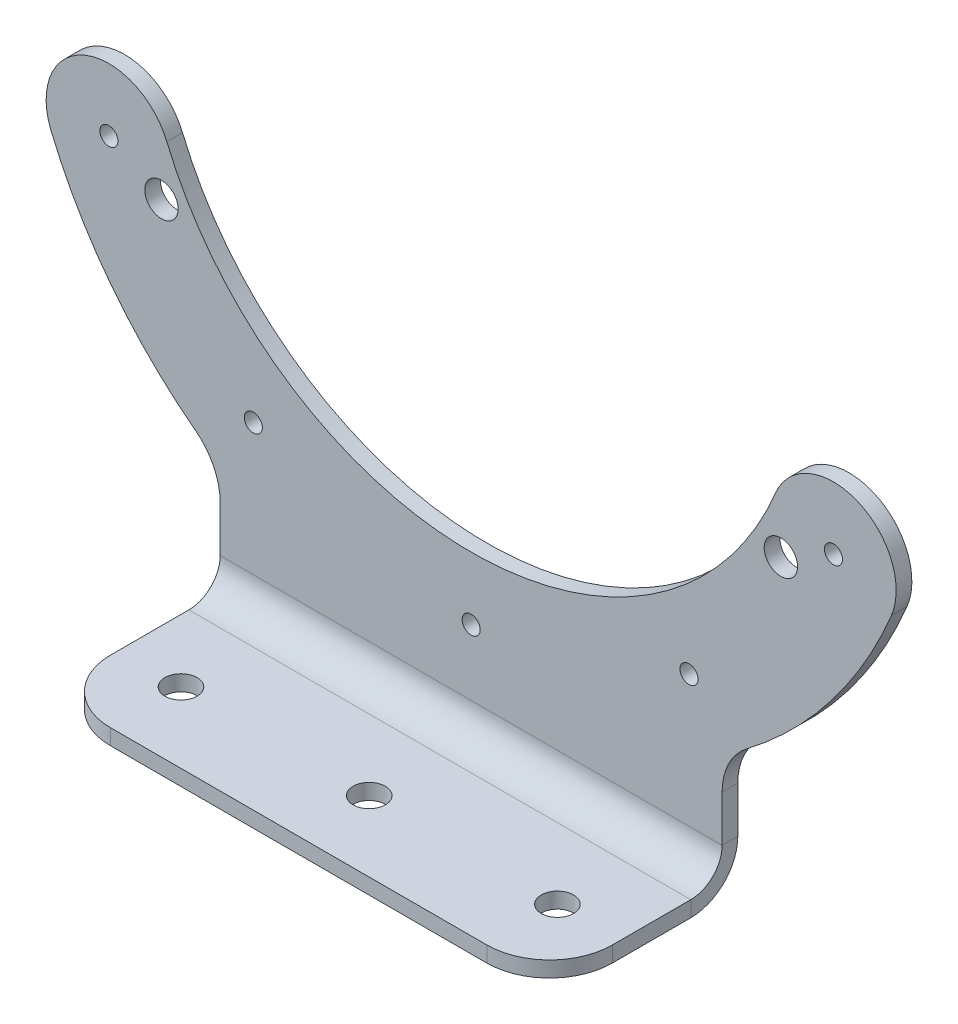
ISO-10303-21;
HEADER;
FILE_DESCRIPTION(('STEP AP214'),'2;1');
FILE_NAME('part.step','',(''),(''),'','','');
FILE_SCHEMA(('AUTOMOTIVE_DESIGN { 1 0 10303 214 1 1 1 1 }'));
ENDSEC;
DATA;
#1=APPLICATION_CONTEXT('core data for automotive mechanical design processes');
#2=APPLICATION_PROTOCOL_DEFINITION('international standard','automotive_design',2000,#1);
#3=PRODUCT_CONTEXT('',#1,'mechanical');
#4=PRODUCT('Part','Part','',(#3));
#5=PRODUCT_RELATED_PRODUCT_CATEGORY('part','',(#4));
#6=PRODUCT_DEFINITION_FORMATION('','',#4);
#7=PRODUCT_DEFINITION_CONTEXT('part definition',#1,'design');
#8=PRODUCT_DEFINITION('design','',#6,#7);
#9=PRODUCT_DEFINITION_SHAPE('','',#8);
#10=(LENGTH_UNIT() NAMED_UNIT(*) SI_UNIT(.MILLI.,.METRE.));
#11=(NAMED_UNIT(*) PLANE_ANGLE_UNIT() SI_UNIT($,.RADIAN.));
#12=(NAMED_UNIT(*) SI_UNIT($,.STERADIAN.) SOLID_ANGLE_UNIT());
#13=UNCERTAINTY_MEASURE_WITH_UNIT(LENGTH_MEASURE(1.E-05),#10,'distance_accuracy_value','');
#14=(GEOMETRIC_REPRESENTATION_CONTEXT(3) GLOBAL_UNCERTAINTY_ASSIGNED_CONTEXT((#13)) GLOBAL_UNIT_ASSIGNED_CONTEXT((#10,
#11,#12)) REPRESENTATION_CONTEXT('',''));
#15=CARTESIAN_POINT('',(0.,0.,0.));
#16=DIRECTION('',(0.,0.,1.));
#17=DIRECTION('',(1.,0.,0.));
#18=AXIS2_PLACEMENT_3D('',#15,#16,#17);
#19=CARTESIAN_POINT('',(50.8,-12.7,-3.175));
#20=DIRECTION('',(1.,0.,0.));
#21=DIRECTION('',(0.,0.,-1.));
#22=AXIS2_PLACEMENT_3D('',#19,#20,#21);
#23=PLANE('',#22);
#24=DIRECTION('',(0.,1.,0.));
#25=VECTOR('',#24,1.);
#26=CARTESIAN_POINT('',(50.8,-12.7,-3.175));
#27=LINE('',#26,#25);
#28=CARTESIAN_POINT('',(50.8,-3.17500000000002,-3.175));
#29=VERTEX_POINT('',#28);
#30=CARTESIAN_POINT('',(50.8,6.15303490016124,-3.175));
#31=VERTEX_POINT('',#30);
#32=EDGE_CURVE('E256',#29,#31,#27,.T.);
#33=ORIENTED_EDGE('',*,*,#32,.T.);
#34=DIRECTION('',(0.,0.,-1.));
#35=VECTOR('',#34,1.);
#36=CARTESIAN_POINT('',(50.8,6.15303490016124,0.));
#37=LINE('',#36,#35);
#38=CARTESIAN_POINT('',(50.8,6.15303490016124,0.));
#39=VERTEX_POINT('',#38);
#40=EDGE_CURVE('E301',#31,#39,#37,.F.);
#41=ORIENTED_EDGE('',*,*,#40,.T.);
#42=DIRECTION('',(0.,1.,0.));
#43=VECTOR('',#42,1.);
#44=CARTESIAN_POINT('',(50.8,-12.7,0.));
#45=LINE('',#44,#43);
#46=CARTESIAN_POINT('',(50.8,-3.17500000000003,0.));
#47=VERTEX_POINT('',#46);
#48=EDGE_CURVE('E242',#47,#39,#45,.T.);
#49=ORIENTED_EDGE('',*,*,#48,.F.);
#50=DIRECTION('',(0.,0.,-1.));
#51=VECTOR('',#50,1.);
#52=CARTESIAN_POINT('',(50.8,-3.17500000000002,0.));
#53=LINE('',#52,#51);
#54=EDGE_CURVE('E225',#47,#29,#53,.T.);
#55=ORIENTED_EDGE('',*,*,#54,.T.);
#56=EDGE_LOOP('',(#33,#41,#49,#55));
#57=FACE_BOUND('',#56,.T.);
#58=ADVANCED_FACE('F56',(#57),#23,.T.);
#59=CARTESIAN_POINT('',(0.,89.4930050525437,-3.175));
#60=DIRECTION('',(0.,0.,1.));
#61=DIRECTION('',(1.,0.,0.));
#62=AXIS2_PLACEMENT_3D('',#59,#60,#61);
#63=PLANE('',#62);
#64=CARTESIAN_POINT('',(-62.6915789799556,53.2980050525438,-3.175));
#65=DIRECTION('',(0.,0.,1.));
#66=DIRECTION('',(1.,0.,0.));
#67=AXIS2_PLACEMENT_3D('',#64,#65,#66);
#68=CIRCLE('',#67,3.37819999999999);
#69=CARTESIAN_POINT('',(-59.3133789799556,53.2980050525438,-3.175));
#70=VERTEX_POINT('',#69);
#71=EDGE_CURVE('E775',#70,#70,#68,.T.);
#72=ORIENTED_EDGE('',*,*,#71,.T.);
#73=EDGE_LOOP('',(#72));
#74=FACE_BOUND('',#73,.T.);
#75=CARTESIAN_POINT('',(62.6915789799556,53.2980050525438,-3.175));
#76=DIRECTION('',(0.,0.,1.));
#77=DIRECTION('',(1.,0.,0.));
#78=AXIS2_PLACEMENT_3D('',#75,#76,#77);
#79=CIRCLE('',#78,3.37819999999998);
#80=CARTESIAN_POINT('',(66.0697789799556,53.2980050525438,-3.175));
#81=VERTEX_POINT('',#80);
#82=EDGE_CURVE('E771',#81,#81,#79,.T.);
#83=ORIENTED_EDGE('',*,*,#82,.T.);
#84=EDGE_LOOP('',(#83));
#85=FACE_BOUND('',#84,.T.);
#86=CARTESIAN_POINT('',(73.3329378930834,59.1175076085648,-3.175));
#87=DIRECTION('',(0.,0.,1.));
#88=DIRECTION('',(1.,0.,0.));
#89=AXIS2_PLACEMENT_3D('',#86,#87,#88);
#90=CIRCLE('',#89,1.82879999999999);
#91=CARTESIAN_POINT('',(75.1617378930834,59.1175076085648,-3.175));
#92=VERTEX_POINT('',#91);
#93=EDGE_CURVE('E767',#92,#92,#90,.T.);
#94=ORIENTED_EDGE('',*,*,#93,.T.);
#95=EDGE_LOOP('',(#94));
#96=FACE_BOUND('',#95,.T.);
#97=CARTESIAN_POINT('',(44.0983872459309,23.4951045760292,-3.175));
#98=DIRECTION('',(0.,0.,1.));
#99=DIRECTION('',(1.,0.,0.));
#100=AXIS2_PLACEMENT_3D('',#97,#98,#99);
#101=CIRCLE('',#100,1.82879999999999);
#102=CARTESIAN_POINT('',(45.9271872459309,23.4951045760292,-3.175));
#103=VERTEX_POINT('',#102);
#104=EDGE_CURVE('E763',#103,#103,#101,.T.);
#105=ORIENTED_EDGE('',*,*,#104,.T.);
#106=EDGE_LOOP('',(#105));
#107=FACE_BOUND('',#106,.T.);
#108=CARTESIAN_POINT('',(-1.11022302462516E-13,10.1180050525437,-3.175));
#109=DIRECTION('',(0.,0.,1.));
#110=DIRECTION('',(1.,0.,0.));
#111=AXIS2_PLACEMENT_3D('',#108,#109,#110);
#112=CIRCLE('',#111,1.82879999999999);
#113=CARTESIAN_POINT('',(1.82879999999988,10.1180050525437,-3.175));
#114=VERTEX_POINT('',#113);
#115=EDGE_CURVE('E758',#114,#114,#112,.T.);
#116=ORIENTED_EDGE('',*,*,#115,.T.);
#117=EDGE_LOOP('',(#116));
#118=FACE_BOUND('',#117,.T.);
#119=CARTESIAN_POINT('',(-44.0983872459311,23.4951045760293,-3.175));
#120=DIRECTION('',(0.,0.,1.));
#121=DIRECTION('',(1.,0.,0.));
#122=AXIS2_PLACEMENT_3D('',#119,#120,#121);
#123=CIRCLE('',#122,1.82879999999999);
#124=CARTESIAN_POINT('',(-42.2695872459311,23.4951045760293,-3.175));
#125=VERTEX_POINT('',#124);
#126=EDGE_CURVE('E436',#125,#125,#123,.T.);
#127=ORIENTED_EDGE('',*,*,#126,.T.);
#128=EDGE_LOOP('',(#127));
#129=FACE_BOUND('',#128,.T.);
#130=CARTESIAN_POINT('',(-73.3329378930835,59.117507608565,-3.175));
#131=DIRECTION('',(0.,0.,1.));
#132=DIRECTION('',(1.,0.,0.));
#133=AXIS2_PLACEMENT_3D('',#130,#131,#132);
#134=CIRCLE('',#133,1.82879999999999);
#135=CARTESIAN_POINT('',(-71.5041378930835,59.117507608565,-3.175));
#136=VERTEX_POINT('',#135);
#137=EDGE_CURVE('E435',#136,#136,#134,.T.);
#138=ORIENTED_EDGE('',*,*,#137,.T.);
#139=EDGE_LOOP('',(#138));
#140=FACE_BOUND('',#139,.T.);
#141=DIRECTION('',(1.,0.,0.));
#142=VECTOR('',#141,1.);
#143=CARTESIAN_POINT('',(50.8,-3.17500000000002,-3.175));
#144=LINE('',#143,#142);
#145=CARTESIAN_POINT('',(-50.8,-3.17500000000001,-3.175));
#146=VERTEX_POINT('',#145);
#147=EDGE_CURVE('E176',#29,#146,#144,.F.);
#148=ORIENTED_EDGE('',*,*,#147,.T.);
#149=DIRECTION('',(0.,-1.,0.));
#150=VECTOR('',#149,1.);
#151=CARTESIAN_POINT('',(-50.8,-12.7,-3.175));
#152=LINE('',#151,#150);
#153=CARTESIAN_POINT('',(-50.8,6.15303490016124,-3.175));
#154=VERTEX_POINT('',#153);
#155=EDGE_CURVE('E254',#154,#146,#152,.T.);
#156=ORIENTED_EDGE('',*,*,#155,.F.);
#157=CARTESIAN_POINT('',(-63.5,6.15303490016124,-3.175));
#158=DIRECTION('',(0.,0.,1.));
#159=DIRECTION('',(1.,0.,0.));
#160=AXIS2_PLACEMENT_3D('',#157,#158,#159);
#161=CIRCLE('',#160,12.7);
#162=CARTESIAN_POINT('',(-55.8030303030303,16.2548494640864,-3.175));
#163=VERTEX_POINT('',#162);
#164=EDGE_CURVE('E13',#154,#163,#161,.T.);
#165=ORIENTED_EDGE('',*,*,#164,.T.);
#166=CARTESIAN_POINT('',(0.,89.4930050525437,-3.175));
#167=DIRECTION('',(0.,0.,1.));
#168=DIRECTION('',(1.,0.,0.));
#169=AXIS2_PLACEMENT_3D('',#166,#167,#168);
#170=CIRCLE('',#169,92.075);
#171=CARTESIAN_POINT('',(-85.0662079559768,54.2574280175283,-3.175));
#172=VERTEX_POINT('',#171);
#173=EDGE_CURVE('E251',#172,#163,#170,.T.);
#174=ORIENTED_EDGE('',*,*,#173,.F.);
#175=CARTESIAN_POINT('',(-73.3329378930835,59.1175076085649,-3.175));
#176=DIRECTION('',(0.,0.,1.));
#177=DIRECTION('',(-1.,0.,0.));
#178=AXIS2_PLACEMENT_3D('',#175,#176,#177);
#179=CIRCLE('',#178,12.7);
#180=CARTESIAN_POINT('',(-61.5996678301901,63.9775871996015,-3.175));
#181=VERTEX_POINT('',#180);
#182=EDGE_CURVE('E248',#181,#172,#179,.T.);
#183=ORIENTED_EDGE('',*,*,#182,.F.);
#184=CARTESIAN_POINT('',(0.,89.4930050525437,-3.175));
#185=DIRECTION('',(0.,0.,-1.));
#186=DIRECTION('',(1.,0.,0.));
#187=AXIS2_PLACEMENT_3D('',#184,#185,#186);
#188=CIRCLE('',#187,66.675);
#189=CARTESIAN_POINT('',(61.5996678301901,63.9775871996015,-3.175));
#190=VERTEX_POINT('',#189);
#191=EDGE_CURVE('E245',#190,#181,#188,.T.);
#192=ORIENTED_EDGE('',*,*,#191,.F.);
#193=CARTESIAN_POINT('',(73.3329378930835,59.1175076085649,-3.175));
#194=DIRECTION('',(0.,0.,1.));
#195=DIRECTION('',(-1.,0.,0.));
#196=AXIS2_PLACEMENT_3D('',#193,#194,#195);
#197=CIRCLE('',#196,12.7);
#198=CARTESIAN_POINT('',(85.0662079559769,54.2574280175283,-3.175));
#199=VERTEX_POINT('',#198);
#200=EDGE_CURVE('E241',#199,#190,#197,.T.);
#201=ORIENTED_EDGE('',*,*,#200,.F.);
#202=CARTESIAN_POINT('',(0.,89.4930050525437,-3.175));
#203=DIRECTION('',(0.,0.,1.));
#204=DIRECTION('',(1.,0.,0.));
#205=AXIS2_PLACEMENT_3D('',#202,#203,#204);
#206=CIRCLE('',#205,92.075);
#207=CARTESIAN_POINT('',(55.8030303030303,16.2548494640864,-3.175));
#208=VERTEX_POINT('',#207);
#209=EDGE_CURVE('E239',#208,#199,#206,.T.);
#210=ORIENTED_EDGE('',*,*,#209,.F.);
#211=CARTESIAN_POINT('',(63.5,6.15303490016124,-3.175));
#212=DIRECTION('',(0.,0.,1.));
#213=DIRECTION('',(1.,0.,0.));
#214=AXIS2_PLACEMENT_3D('',#211,#212,#213);
#215=CIRCLE('',#214,12.7);
#216=EDGE_CURVE('E312',#208,#31,#215,.T.);
#217=ORIENTED_EDGE('',*,*,#216,.T.);
#218=ORIENTED_EDGE('',*,*,#32,.F.);
#219=EDGE_LOOP('',(#148,#156,#165,#174,#183,#192,#201,#210,#217,#218));
#220=FACE_BOUND('',#219,.T.);
#221=ADVANCED_FACE('F316',(#74,#85,#96,#107,#118,#129,#140,#220),#63,.F.);
#222=CARTESIAN_POINT('',(0.,89.4930050525437,0.));
#223=DIRECTION('',(0.,0.,1.));
#224=DIRECTION('',(1.,0.,0.));
#225=AXIS2_PLACEMENT_3D('',#222,#223,#224);
#226=PLANE('',#225);
#227=CARTESIAN_POINT('',(-62.6915789799556,53.2980050525438,0.));
#228=DIRECTION('',(0.,0.,1.));
#229=DIRECTION('',(1.,0.,0.));
#230=AXIS2_PLACEMENT_3D('',#227,#228,#229);
#231=CIRCLE('',#230,3.37819999999999);
#232=CARTESIAN_POINT('',(-59.3133789799556,53.2980050525438,0.));
#233=VERTEX_POINT('',#232);
#234=EDGE_CURVE('E410',#233,#233,#231,.T.);
#235=ORIENTED_EDGE('',*,*,#234,.F.);
#236=EDGE_LOOP('',(#235));
#237=FACE_BOUND('',#236,.T.);
#238=CARTESIAN_POINT('',(62.6915789799556,53.2980050525438,0.));
#239=DIRECTION('',(0.,0.,1.));
#240=DIRECTION('',(1.,0.,0.));
#241=AXIS2_PLACEMENT_3D('',#238,#239,#240);
#242=CIRCLE('',#241,3.37819999999998);
#243=CARTESIAN_POINT('',(66.0697789799556,53.2980050525438,0.));
#244=VERTEX_POINT('',#243);
#245=EDGE_CURVE('E414',#244,#244,#242,.T.);
#246=ORIENTED_EDGE('',*,*,#245,.F.);
#247=EDGE_LOOP('',(#246));
#248=FACE_BOUND('',#247,.T.);
#249=CARTESIAN_POINT('',(73.3329378930834,59.1175076085648,0.));
#250=DIRECTION('',(0.,0.,1.));
#251=DIRECTION('',(1.,0.,0.));
#252=AXIS2_PLACEMENT_3D('',#249,#250,#251);
#253=CIRCLE('',#252,1.82879999999999);
#254=CARTESIAN_POINT('',(75.1617378930834,59.1175076085648,0.));
#255=VERTEX_POINT('',#254);
#256=EDGE_CURVE('E418',#255,#255,#253,.T.);
#257=ORIENTED_EDGE('',*,*,#256,.F.);
#258=EDGE_LOOP('',(#257));
#259=FACE_BOUND('',#258,.T.);
#260=CARTESIAN_POINT('',(44.0983872459309,23.4951045760292,0.));
#261=DIRECTION('',(0.,0.,1.));
#262=DIRECTION('',(1.,0.,0.));
#263=AXIS2_PLACEMENT_3D('',#260,#261,#262);
#264=CIRCLE('',#263,1.82879999999999);
#265=CARTESIAN_POINT('',(45.9271872459309,23.4951045760292,0.));
#266=VERTEX_POINT('',#265);
#267=EDGE_CURVE('E422',#266,#266,#264,.T.);
#268=ORIENTED_EDGE('',*,*,#267,.F.);
#269=EDGE_LOOP('',(#268));
#270=FACE_BOUND('',#269,.T.);
#271=CARTESIAN_POINT('',(-1.11022302462516E-13,10.1180050525437,0.));
#272=DIRECTION('',(0.,0.,1.));
#273=DIRECTION('',(1.,0.,0.));
#274=AXIS2_PLACEMENT_3D('',#271,#272,#273);
#275=CIRCLE('',#274,1.82879999999999);
#276=CARTESIAN_POINT('',(1.82879999999988,10.1180050525437,0.));
#277=VERTEX_POINT('',#276);
#278=EDGE_CURVE('E426',#277,#277,#275,.T.);
#279=ORIENTED_EDGE('',*,*,#278,.F.);
#280=EDGE_LOOP('',(#279));
#281=FACE_BOUND('',#280,.T.);
#282=CARTESIAN_POINT('',(-44.0983872459311,23.4951045760293,0.));
#283=DIRECTION('',(0.,0.,1.));
#284=DIRECTION('',(1.,0.,0.));
#285=AXIS2_PLACEMENT_3D('',#282,#283,#284);
#286=CIRCLE('',#285,1.82879999999999);
#287=CARTESIAN_POINT('',(-42.2695872459311,23.4951045760293,0.));
#288=VERTEX_POINT('',#287);
#289=EDGE_CURVE('E430',#288,#288,#286,.T.);
#290=ORIENTED_EDGE('',*,*,#289,.F.);
#291=EDGE_LOOP('',(#290));
#292=FACE_BOUND('',#291,.T.);
#293=CARTESIAN_POINT('',(-73.3329378930835,59.117507608565,0.));
#294=DIRECTION('',(0.,0.,1.));
#295=DIRECTION('',(1.,0.,0.));
#296=AXIS2_PLACEMENT_3D('',#293,#294,#295);
#297=CIRCLE('',#296,1.82879999999999);
#298=CARTESIAN_POINT('',(-71.5041378930835,59.117507608565,0.));
#299=VERTEX_POINT('',#298);
#300=EDGE_CURVE('E433',#299,#299,#297,.T.);
#301=ORIENTED_EDGE('',*,*,#300,.F.);
#302=EDGE_LOOP('',(#301));
#303=FACE_BOUND('',#302,.T.);
#304=CARTESIAN_POINT('',(0.,89.4930050525437,0.));
#305=DIRECTION('',(0.,0.,1.));
#306=DIRECTION('',(1.,0.,0.));
#307=AXIS2_PLACEMENT_3D('',#304,#305,#306);
#308=CIRCLE('',#307,92.075);
#309=CARTESIAN_POINT('',(-85.0662079559768,54.2574280175283,0.));
#310=VERTEX_POINT('',#309);
#311=CARTESIAN_POINT('',(-55.8030303030303,16.2548494640864,0.));
#312=VERTEX_POINT('',#311);
#313=EDGE_CURVE('E270',#310,#312,#308,.T.);
#314=ORIENTED_EDGE('',*,*,#313,.T.);
#315=CARTESIAN_POINT('',(-63.5,6.15303490016124,0.));
#316=DIRECTION('',(0.,0.,1.));
#317=DIRECTION('',(1.,0.,0.));
#318=AXIS2_PLACEMENT_3D('',#315,#316,#317);
#319=CIRCLE('',#318,12.7);
#320=CARTESIAN_POINT('',(-50.8,6.15303490016124,0.));
#321=VERTEX_POINT('',#320);
#322=EDGE_CURVE('E64',#312,#321,#319,.F.);
#323=ORIENTED_EDGE('',*,*,#322,.T.);
#324=DIRECTION('',(0.,-1.,0.));
#325=VECTOR('',#324,1.);
#326=CARTESIAN_POINT('',(-50.8,-12.7,0.));
#327=LINE('',#326,#325);
#328=CARTESIAN_POINT('',(-50.8,-3.17500000000003,0.));
#329=VERTEX_POINT('',#328);
#330=EDGE_CURVE('E272',#321,#329,#327,.T.);
#331=ORIENTED_EDGE('',*,*,#330,.T.);
#332=DIRECTION('',(1.,0.,0.));
#333=VECTOR('',#332,1.);
#334=CARTESIAN_POINT('',(50.8,-3.17500000000002,0.));
#335=LINE('',#334,#333);
#336=EDGE_CURVE('E229',#47,#329,#335,.F.);
#337=ORIENTED_EDGE('',*,*,#336,.F.);
#338=ORIENTED_EDGE('',*,*,#48,.T.);
#339=CARTESIAN_POINT('',(63.5,6.15303490016124,0.));
#340=DIRECTION('',(0.,0.,1.));
#341=DIRECTION('',(1.,0.,0.));
#342=AXIS2_PLACEMENT_3D('',#339,#340,#341);
#343=CIRCLE('',#342,12.7);
#344=CARTESIAN_POINT('',(55.8030303030303,16.2548494640864,0.));
#345=VERTEX_POINT('',#344);
#346=EDGE_CURVE('E310',#39,#345,#343,.F.);
#347=ORIENTED_EDGE('',*,*,#346,.T.);
#348=CARTESIAN_POINT('',(0.,89.4930050525437,0.));
#349=DIRECTION('',(0.,0.,1.));
#350=DIRECTION('',(1.,0.,0.));
#351=AXIS2_PLACEMENT_3D('',#348,#349,#350);
#352=CIRCLE('',#351,92.075);
#353=CARTESIAN_POINT('',(85.0662079559769,54.2574280175283,0.));
#354=VERTEX_POINT('',#353);
#355=EDGE_CURVE('E236',#345,#354,#352,.T.);
#356=ORIENTED_EDGE('',*,*,#355,.T.);
#357=CARTESIAN_POINT('',(73.3329378930835,59.1175076085649,0.));
#358=DIRECTION('',(0.,0.,1.));
#359=DIRECTION('',(-1.,0.,0.));
#360=AXIS2_PLACEMENT_3D('',#357,#358,#359);
#361=CIRCLE('',#360,12.7);
#362=CARTESIAN_POINT('',(61.5996678301901,63.9775871996015,0.));
#363=VERTEX_POINT('',#362);
#364=EDGE_CURVE('E261',#354,#363,#361,.T.);
#365=ORIENTED_EDGE('',*,*,#364,.T.);
#366=CARTESIAN_POINT('',(0.,89.4930050525437,0.));
#367=DIRECTION('',(0.,0.,-1.));
#368=DIRECTION('',(1.,0.,0.));
#369=AXIS2_PLACEMENT_3D('',#366,#367,#368);
#370=CIRCLE('',#369,66.675);
#371=CARTESIAN_POINT('',(-61.5996678301901,63.9775871996015,0.));
#372=VERTEX_POINT('',#371);
#373=EDGE_CURVE('E264',#363,#372,#370,.T.);
#374=ORIENTED_EDGE('',*,*,#373,.T.);
#375=CARTESIAN_POINT('',(-73.3329378930835,59.1175076085649,0.));
#376=DIRECTION('',(0.,0.,1.));
#377=DIRECTION('',(-1.,0.,0.));
#378=AXIS2_PLACEMENT_3D('',#375,#376,#377);
#379=CIRCLE('',#378,12.7);
#380=EDGE_CURVE('E267',#372,#310,#379,.T.);
#381=ORIENTED_EDGE('',*,*,#380,.T.);
#382=EDGE_LOOP('',(#314,#323,#331,#337,#338,#347,#356,#365,#374,#381));
#383=FACE_BOUND('',#382,.T.);
#384=ADVANCED_FACE('F325',(#237,#248,#259,#270,#281,#292,#303,#383),#226,.T.);
#385=CARTESIAN_POINT('',(0.,89.4930050525437,-3.175));
#386=DIRECTION('',(0.,0.,1.));
#387=DIRECTION('',(1.,0.,0.));
#388=AXIS2_PLACEMENT_3D('',#385,#386,#387);
#389=CYLINDRICAL_SURFACE('',#388,92.075);
#390=ORIENTED_EDGE('',*,*,#355,.F.);
#391=DIRECTION('',(0.,0.,1.));
#392=VECTOR('',#391,1.);
#393=CARTESIAN_POINT('',(55.8030303030303,16.2548494640864,-3.175));
#394=LINE('',#393,#392);
#395=EDGE_CURVE('E304',#345,#208,#394,.F.);
#396=ORIENTED_EDGE('',*,*,#395,.T.);
#397=ORIENTED_EDGE('',*,*,#209,.T.);
#398=DIRECTION('',(0.,0.,1.));
#399=VECTOR('',#398,1.);
#400=CARTESIAN_POINT('',(85.0662079559769,54.2574280175283,-3.175));
#401=LINE('',#400,#399);
#402=EDGE_CURVE('E259',#199,#354,#401,.T.);
#403=ORIENTED_EDGE('',*,*,#402,.T.);
#404=EDGE_LOOP('',(#390,#396,#397,#403));
#405=FACE_BOUND('',#404,.T.);
#406=ADVANCED_FACE('F327',(#405),#389,.T.);
#407=CARTESIAN_POINT('',(-50.8,-12.7,-3.175));
#408=DIRECTION('',(-1.,0.,0.));
#409=DIRECTION('',(0.,0.,1.));
#410=AXIS2_PLACEMENT_3D('',#407,#408,#409);
#411=PLANE('',#410);
#412=ORIENTED_EDGE('',*,*,#330,.F.);
#413=DIRECTION('',(0.,0.,-1.));
#414=VECTOR('',#413,1.);
#415=CARTESIAN_POINT('',(-50.8,6.15303490016124,-3.175));
#416=LINE('',#415,#414);
#417=EDGE_CURVE('E71',#321,#154,#416,.T.);
#418=ORIENTED_EDGE('',*,*,#417,.T.);
#419=ORIENTED_EDGE('',*,*,#155,.T.);
#420=DIRECTION('',(0.,0.,-1.));
#421=VECTOR('',#420,1.);
#422=CARTESIAN_POINT('',(-50.8,-3.17500000000003,0.));
#423=LINE('',#422,#421);
#424=EDGE_CURVE('E233',#329,#146,#423,.T.);
#425=ORIENTED_EDGE('',*,*,#424,.F.);
#426=EDGE_LOOP('',(#412,#418,#419,#425));
#427=FACE_BOUND('',#426,.T.);
#428=ADVANCED_FACE('F348',(#427),#411,.T.);
#429=CARTESIAN_POINT('',(0.,89.4930050525437,-3.175));
#430=DIRECTION('',(0.,0.,1.));
#431=DIRECTION('',(1.,0.,0.));
#432=AXIS2_PLACEMENT_3D('',#429,#430,#431);
#433=CYLINDRICAL_SURFACE('',#432,92.075);
#434=ORIENTED_EDGE('',*,*,#173,.T.);
#435=DIRECTION('',(0.,0.,1.));
#436=VECTOR('',#435,1.);
#437=CARTESIAN_POINT('',(-55.8030303030303,16.2548494640864,-3.175));
#438=LINE('',#437,#436);
#439=EDGE_CURVE('E306',#163,#312,#438,.T.);
#440=ORIENTED_EDGE('',*,*,#439,.T.);
#441=ORIENTED_EDGE('',*,*,#313,.F.);
#442=DIRECTION('',(0.,0.,1.));
#443=VECTOR('',#442,1.);
#444=CARTESIAN_POINT('',(-85.0662079559768,54.2574280175283,-3.175));
#445=LINE('',#444,#443);
#446=EDGE_CURVE('E276',#172,#310,#445,.T.);
#447=ORIENTED_EDGE('',*,*,#446,.F.);
#448=EDGE_LOOP('',(#434,#440,#441,#447));
#449=FACE_BOUND('',#448,.T.);
#450=ADVANCED_FACE('F343',(#449),#433,.T.);
#451=CARTESIAN_POINT('',(-73.3329378930835,59.1175076085649,-3.175));
#452=DIRECTION('',(0.,0.,1.));
#453=DIRECTION('',(1.,0.,0.));
#454=AXIS2_PLACEMENT_3D('',#451,#452,#453);
#455=CYLINDRICAL_SURFACE('',#454,12.7);
#456=ORIENTED_EDGE('',*,*,#380,.F.);
#457=DIRECTION('',(0.,0.,1.));
#458=VECTOR('',#457,1.);
#459=CARTESIAN_POINT('',(-61.5996678301901,63.9775871996015,-3.175));
#460=LINE('',#459,#458);
#461=EDGE_CURVE('E279',#181,#372,#460,.T.);
#462=ORIENTED_EDGE('',*,*,#461,.F.);
#463=ORIENTED_EDGE('',*,*,#182,.T.);
#464=ORIENTED_EDGE('',*,*,#446,.T.);
#465=EDGE_LOOP('',(#456,#462,#463,#464));
#466=FACE_BOUND('',#465,.T.);
#467=ADVANCED_FACE('F339',(#466),#455,.T.);
#468=CARTESIAN_POINT('',(0.,89.4930050525437,-3.175));
#469=DIRECTION('',(0.,0.,1.));
#470=DIRECTION('',(1.,0.,0.));
#471=AXIS2_PLACEMENT_3D('',#468,#469,#470);
#472=CYLINDRICAL_SURFACE('',#471,66.675);
#473=ORIENTED_EDGE('',*,*,#373,.F.);
#474=DIRECTION('',(0.,0.,1.));
#475=VECTOR('',#474,1.);
#476=CARTESIAN_POINT('',(61.5996678301901,63.9775871996015,-3.175));
#477=LINE('',#476,#475);
#478=EDGE_CURVE('E281',#190,#363,#477,.T.);
#479=ORIENTED_EDGE('',*,*,#478,.F.);
#480=ORIENTED_EDGE('',*,*,#191,.T.);
#481=ORIENTED_EDGE('',*,*,#461,.T.);
#482=EDGE_LOOP('',(#473,#479,#480,#481));
#483=FACE_BOUND('',#482,.T.);
#484=ADVANCED_FACE('F335',(#483),#472,.F.);
#485=CARTESIAN_POINT('',(73.3329378930835,59.1175076085649,-3.175));
#486=DIRECTION('',(0.,0.,1.));
#487=DIRECTION('',(1.,0.,0.));
#488=AXIS2_PLACEMENT_3D('',#485,#486,#487);
#489=CYLINDRICAL_SURFACE('',#488,12.7);
#490=ORIENTED_EDGE('',*,*,#364,.F.);
#491=ORIENTED_EDGE('',*,*,#402,.F.);
#492=ORIENTED_EDGE('',*,*,#200,.T.);
#493=ORIENTED_EDGE('',*,*,#478,.T.);
#494=EDGE_LOOP('',(#490,#491,#492,#493));
#495=FACE_BOUND('',#494,.T.);
#496=ADVANCED_FACE('F331',(#495),#489,.T.);
#497=CARTESIAN_POINT('',(-50.8,-3.17500000000003,6.35));
#498=DIRECTION('',(-1.,0.,0.));
#499=DIRECTION('',(0.,0.,1.));
#500=AXIS2_PLACEMENT_3D('',#497,#498,#499);
#501=PLANE('',#500);
#502=DIRECTION('',(0.,1.,0.));
#503=VECTOR('',#502,1.);
#504=CARTESIAN_POINT('',(-50.8,-12.7,6.34999999999997));
#505=LINE('',#504,#503);
#506=CARTESIAN_POINT('',(-50.8,-9.52500000000002,6.34999999999998));
#507=VERTEX_POINT('',#506);
#508=CARTESIAN_POINT('',(-50.8,-12.7,6.34999999999997));
#509=VERTEX_POINT('',#508);
#510=EDGE_CURVE('E219',#507,#509,#505,.F.);
#511=ORIENTED_EDGE('',*,*,#510,.F.);
#512=CARTESIAN_POINT('',(-50.8,-3.17500000000003,6.35));
#513=DIRECTION('',(1.,0.,0.));
#514=DIRECTION('',(0.,0.,-1.));
#515=AXIS2_PLACEMENT_3D('',#512,#513,#514);
#516=CIRCLE('',#515,6.35);
#517=EDGE_CURVE('E179',#329,#507,#516,.F.);
#518=ORIENTED_EDGE('',*,*,#517,.F.);
#519=ORIENTED_EDGE('',*,*,#424,.T.);
#520=CARTESIAN_POINT('',(-50.8,-3.17500000000003,6.35));
#521=DIRECTION('',(1.,0.,0.));
#522=DIRECTION('',(0.,0.,-1.));
#523=AXIS2_PLACEMENT_3D('',#520,#521,#522);
#524=CIRCLE('',#523,9.525);
#525=EDGE_CURVE('E224',#146,#509,#524,.F.);
#526=ORIENTED_EDGE('',*,*,#525,.T.);
#527=EDGE_LOOP('',(#511,#518,#519,#526));
#528=FACE_BOUND('',#527,.T.);
#529=ADVANCED_FACE('F355',(#528),#501,.T.);
#530=CARTESIAN_POINT('',(50.8,-3.17500000000002,6.34999999999999));
#531=DIRECTION('',(-1.,0.,0.));
#532=DIRECTION('',(0.,0.,1.));
#533=AXIS2_PLACEMENT_3D('',#530,#531,#532);
#534=PLANE('',#533);
#535=CARTESIAN_POINT('',(50.8,-3.17500000000002,6.34999999999999));
#536=DIRECTION('',(1.,0.,0.));
#537=DIRECTION('',(0.,0.,-1.));
#538=AXIS2_PLACEMENT_3D('',#535,#536,#537);
#539=CIRCLE('',#538,6.35);
#540=CARTESIAN_POINT('',(50.8,-9.52500000000001,6.34999999999997));
#541=VERTEX_POINT('',#540);
#542=EDGE_CURVE('E186',#541,#47,#539,.T.);
#543=ORIENTED_EDGE('',*,*,#542,.F.);
#544=DIRECTION('',(0.,1.,0.));
#545=VECTOR('',#544,1.);
#546=CARTESIAN_POINT('',(50.8,-9.52500000000002,6.34999999999997));
#547=LINE('',#546,#545);
#548=CARTESIAN_POINT('',(50.8,-12.7,6.34999999999996));
#549=VERTEX_POINT('',#548);
#550=EDGE_CURVE('E183',#541,#549,#547,.F.);
#551=ORIENTED_EDGE('',*,*,#550,.T.);
#552=CARTESIAN_POINT('',(50.8,-3.17500000000002,6.34999999999999));
#553=DIRECTION('',(1.,0.,0.));
#554=DIRECTION('',(0.,0.,-1.));
#555=AXIS2_PLACEMENT_3D('',#552,#553,#554);
#556=CIRCLE('',#555,9.525);
#557=EDGE_CURVE('E168',#549,#29,#556,.T.);
#558=ORIENTED_EDGE('',*,*,#557,.T.);
#559=ORIENTED_EDGE('',*,*,#54,.F.);
#560=EDGE_LOOP('',(#543,#551,#558,#559));
#561=FACE_BOUND('',#560,.T.);
#562=ADVANCED_FACE('F184',(#561),#534,.F.);
#563=CARTESIAN_POINT('',(50.8,-3.17500000000002,6.34999999999999));
#564=DIRECTION('',(1.,0.,0.));
#565=DIRECTION('',(0.,-1.,0.));
#566=AXIS2_PLACEMENT_3D('',#563,#564,#565);
#567=CYLINDRICAL_SURFACE('',#566,9.525);
#568=ORIENTED_EDGE('',*,*,#147,.F.);
#569=ORIENTED_EDGE('',*,*,#557,.F.);
#570=DIRECTION('',(1.,0.,0.));
#571=VECTOR('',#570,1.);
#572=CARTESIAN_POINT('',(-50.8,-12.7,6.34999999999997));
#573=LINE('',#572,#571);
#574=EDGE_CURVE('E173',#549,#509,#573,.F.);
#575=ORIENTED_EDGE('',*,*,#574,.T.);
#576=ORIENTED_EDGE('',*,*,#525,.F.);
#577=EDGE_LOOP('',(#568,#569,#575,#576));
#578=FACE_BOUND('',#577,.T.);
#579=ADVANCED_FACE('F170',(#578),#567,.T.);
#580=CARTESIAN_POINT('',(50.8,-3.17500000000002,6.34999999999999));
#581=DIRECTION('',(1.,0.,0.));
#582=DIRECTION('',(0.,-1.,0.));
#583=AXIS2_PLACEMENT_3D('',#580,#581,#582);
#584=CYLINDRICAL_SURFACE('',#583,6.35);
#585=ORIENTED_EDGE('',*,*,#336,.T.);
#586=ORIENTED_EDGE('',*,*,#517,.T.);
#587=DIRECTION('',(1.,0.,0.));
#588=VECTOR('',#587,1.);
#589=CARTESIAN_POINT('',(-50.8,-9.52500000000002,6.34999999999998));
#590=LINE('',#589,#588);
#591=EDGE_CURVE('E191',#507,#541,#590,.T.);
#592=ORIENTED_EDGE('',*,*,#591,.T.);
#593=ORIENTED_EDGE('',*,*,#542,.T.);
#594=EDGE_LOOP('',(#585,#586,#592,#593));
#595=FACE_BOUND('',#594,.T.);
#596=ADVANCED_FACE('F352',(#595),#584,.F.);
#597=CARTESIAN_POINT('',(-50.8,-12.7,0.));
#598=DIRECTION('',(1.,0.,0.));
#599=DIRECTION('',(0.,0.,-1.));
#600=AXIS2_PLACEMENT_3D('',#597,#598,#599);
#601=PLANE('',#600);
#602=DIRECTION('',(0.,0.,-1.));
#603=VECTOR('',#602,1.);
#604=CARTESIAN_POINT('',(-50.8,-12.7,0.));
#605=LINE('',#604,#603);
#606=CARTESIAN_POINT('',(-50.8,-12.7000000000001,22.225));
#607=VERTEX_POINT('',#606);
#608=EDGE_CURVE('E199',#607,#509,#605,.T.);
#609=ORIENTED_EDGE('',*,*,#608,.F.);
#610=DIRECTION('',(0.,1.,0.));
#611=VECTOR('',#610,1.);
#612=CARTESIAN_POINT('',(-50.8,-12.7000000000001,22.225));
#613=LINE('',#612,#611);
#614=CARTESIAN_POINT('',(-50.8,-9.52500000000008,22.225));
#615=VERTEX_POINT('',#614);
#616=EDGE_CURVE('E298',#607,#615,#613,.T.);
#617=ORIENTED_EDGE('',*,*,#616,.T.);
#618=DIRECTION('',(0.,0.,1.));
#619=VECTOR('',#618,1.);
#620=CARTESIAN_POINT('',(-50.8,-9.525,0.));
#621=LINE('',#620,#619);
#622=EDGE_CURVE('E200',#615,#507,#621,.F.);
#623=ORIENTED_EDGE('',*,*,#622,.T.);
#624=ORIENTED_EDGE('',*,*,#510,.T.);
#625=EDGE_LOOP('',(#609,#617,#623,#624));
#626=FACE_BOUND('',#625,.T.);
#627=ADVANCED_FACE('F357',(#626),#601,.F.);
#628=CARTESIAN_POINT('',(50.8,-12.7000000000001,34.925));
#629=DIRECTION('',(-1.,0.,0.));
#630=DIRECTION('',(0.,0.,1.));
#631=AXIS2_PLACEMENT_3D('',#628,#629,#630);
#632=PLANE('',#631);
#633=DIRECTION('',(0.,0.,-1.));
#634=VECTOR('',#633,1.);
#635=CARTESIAN_POINT('',(50.8,-9.52500000000012,34.925));
#636=LINE('',#635,#634);
#637=CARTESIAN_POINT('',(50.8,-9.52500000000008,22.225));
#638=VERTEX_POINT('',#637);
#639=EDGE_CURVE('E215',#541,#638,#636,.F.);
#640=ORIENTED_EDGE('',*,*,#639,.T.);
#641=DIRECTION('',(0.,1.,0.));
#642=VECTOR('',#641,1.);
#643=CARTESIAN_POINT('',(50.8,-12.7000000000001,22.225));
#644=LINE('',#643,#642);
#645=CARTESIAN_POINT('',(50.8,-12.7000000000001,22.225));
#646=VERTEX_POINT('',#645);
#647=EDGE_CURVE('E204',#638,#646,#644,.F.);
#648=ORIENTED_EDGE('',*,*,#647,.T.);
#649=DIRECTION('',(0.,0.,1.));
#650=VECTOR('',#649,1.);
#651=CARTESIAN_POINT('',(50.8,-12.7,0.));
#652=LINE('',#651,#650);
#653=EDGE_CURVE('E196',#549,#646,#652,.T.);
#654=ORIENTED_EDGE('',*,*,#653,.F.);
#655=ORIENTED_EDGE('',*,*,#550,.F.);
#656=EDGE_LOOP('',(#640,#648,#654,#655));
#657=FACE_BOUND('',#656,.T.);
#658=ADVANCED_FACE('F202',(#657),#632,.F.);
#659=CARTESIAN_POINT('',(0.,-12.7,0.));
#660=DIRECTION('',(0.,1.,0.));
#661=DIRECTION('',(0.,0.,1.));
#662=AXIS2_PLACEMENT_3D('',#659,#660,#661);
#663=PLANE('',#662);
#664=CARTESIAN_POINT('',(38.1,-12.7000000000001,20.6375));
#665=DIRECTION('',(0.,1.,0.));
#666=DIRECTION('',(0.,0.,1.));
#667=AXIS2_PLACEMENT_3D('',#664,#665,#666);
#668=CIRCLE('',#667,3.26389999999999);
#669=CARTESIAN_POINT('',(38.1,-12.7000000000001,23.9014));
#670=VERTEX_POINT('',#669);
#671=EDGE_CURVE('E447',#670,#670,#668,.T.);
#672=ORIENTED_EDGE('',*,*,#671,.T.);
#673=EDGE_LOOP('',(#672));
#674=FACE_BOUND('',#673,.T.);
#675=CARTESIAN_POINT('',(0.,-12.7000000000001,20.6375));
#676=DIRECTION('',(0.,1.,0.));
#677=DIRECTION('',(0.,0.,1.));
#678=AXIS2_PLACEMENT_3D('',#675,#676,#677);
#679=CIRCLE('',#678,3.26389999999999);
#680=CARTESIAN_POINT('',(0.,-12.7000000000001,23.9014));
#681=VERTEX_POINT('',#680);
#682=EDGE_CURVE('E453',#681,#681,#679,.T.);
#683=ORIENTED_EDGE('',*,*,#682,.T.);
#684=EDGE_LOOP('',(#683));
#685=FACE_BOUND('',#684,.T.);
#686=CARTESIAN_POINT('',(-38.1,-12.7000000000001,20.6375));
#687=DIRECTION('',(0.,1.,0.));
#688=DIRECTION('',(0.,0.,1.));
#689=AXIS2_PLACEMENT_3D('',#686,#687,#688);
#690=CIRCLE('',#689,3.26389999999999);
#691=CARTESIAN_POINT('',(-38.1,-12.7000000000001,23.9014));
#692=VERTEX_POINT('',#691);
#693=EDGE_CURVE('E222',#692,#692,#690,.T.);
#694=ORIENTED_EDGE('',*,*,#693,.T.);
#695=EDGE_LOOP('',(#694));
#696=FACE_BOUND('',#695,.T.);
#697=ORIENTED_EDGE('',*,*,#653,.T.);
#698=CARTESIAN_POINT('',(38.1,-12.7000000000001,22.225));
#699=DIRECTION('',(0.,1.,0.));
#700=DIRECTION('',(0.,0.,1.));
#701=AXIS2_PLACEMENT_3D('',#698,#699,#700);
#702=CIRCLE('',#701,12.7);
#703=CARTESIAN_POINT('',(38.1,-12.7000000000001,34.925));
#704=VERTEX_POINT('',#703);
#705=EDGE_CURVE('E296',#646,#704,#702,.F.);
#706=ORIENTED_EDGE('',*,*,#705,.T.);
#707=DIRECTION('',(-1.,0.,0.));
#708=VECTOR('',#707,1.);
#709=CARTESIAN_POINT('',(0.,-12.7000000000001,34.925));
#710=LINE('',#709,#708);
#711=CARTESIAN_POINT('',(-38.1,-12.7000000000001,34.925));
#712=VERTEX_POINT('',#711);
#713=EDGE_CURVE('E205',#704,#712,#710,.T.);
#714=ORIENTED_EDGE('',*,*,#713,.T.);
#715=CARTESIAN_POINT('',(-38.1,-12.7000000000001,22.225));
#716=DIRECTION('',(0.,1.,0.));
#717=DIRECTION('',(0.,0.,1.));
#718=AXIS2_PLACEMENT_3D('',#715,#716,#717);
#719=CIRCLE('',#718,12.7);
#720=EDGE_CURVE('E294',#712,#607,#719,.F.);
#721=ORIENTED_EDGE('',*,*,#720,.T.);
#722=ORIENTED_EDGE('',*,*,#608,.T.);
#723=ORIENTED_EDGE('',*,*,#574,.F.);
#724=EDGE_LOOP('',(#697,#706,#714,#721,#722,#723));
#725=FACE_BOUND('',#724,.T.);
#726=ADVANCED_FACE('F195',(#674,#685,#696,#725),#663,.F.);
#727=CARTESIAN_POINT('',(0.,-9.525,0.));
#728=DIRECTION('',(0.,1.,0.));
#729=DIRECTION('',(0.,0.,1.));
#730=AXIS2_PLACEMENT_3D('',#727,#728,#729);
#731=PLANE('',#730);
#732=CARTESIAN_POINT('',(38.1,-9.52500000000007,20.6375));
#733=DIRECTION('',(0.,1.,0.));
#734=DIRECTION('',(0.,0.,1.));
#735=AXIS2_PLACEMENT_3D('',#732,#733,#734);
#736=CIRCLE('',#735,3.26389999999999);
#737=CARTESIAN_POINT('',(38.1,-9.52500000000008,23.9014));
#738=VERTEX_POINT('',#737);
#739=EDGE_CURVE('E439',#738,#738,#736,.T.);
#740=ORIENTED_EDGE('',*,*,#739,.F.);
#741=EDGE_LOOP('',(#740));
#742=FACE_BOUND('',#741,.T.);
#743=CARTESIAN_POINT('',(0.,-9.52500000000007,20.6375));
#744=DIRECTION('',(0.,1.,0.));
#745=DIRECTION('',(0.,0.,1.));
#746=AXIS2_PLACEMENT_3D('',#743,#744,#745);
#747=CIRCLE('',#746,3.2639);
#748=CARTESIAN_POINT('',(0.,-9.52500000000008,23.9014));
#749=VERTEX_POINT('',#748);
#750=EDGE_CURVE('E450',#749,#749,#747,.T.);
#751=ORIENTED_EDGE('',*,*,#750,.F.);
#752=EDGE_LOOP('',(#751));
#753=FACE_BOUND('',#752,.T.);
#754=CARTESIAN_POINT('',(-38.1,-9.52500000000007,20.6375));
#755=DIRECTION('',(0.,1.,0.));
#756=DIRECTION('',(0.,0.,1.));
#757=AXIS2_PLACEMENT_3D('',#754,#755,#756);
#758=CIRCLE('',#757,3.26389999999999);
#759=CARTESIAN_POINT('',(-38.1,-9.52500000000008,23.9014));
#760=VERTEX_POINT('',#759);
#761=EDGE_CURVE('E456',#760,#760,#758,.T.);
#762=ORIENTED_EDGE('',*,*,#761,.F.);
#763=EDGE_LOOP('',(#762));
#764=FACE_BOUND('',#763,.T.);
#765=DIRECTION('',(1.,0.,0.));
#766=VECTOR('',#765,1.);
#767=CARTESIAN_POINT('',(-50.8,-9.52500000000012,34.925));
#768=LINE('',#767,#766);
#769=CARTESIAN_POINT('',(38.1,-9.52500000000012,34.925));
#770=VERTEX_POINT('',#769);
#771=CARTESIAN_POINT('',(-38.1,-9.52500000000012,34.925));
#772=VERTEX_POINT('',#771);
#773=EDGE_CURVE('E209',#770,#772,#768,.F.);
#774=ORIENTED_EDGE('',*,*,#773,.F.);
#775=CARTESIAN_POINT('',(38.1,-9.52500000000007,22.225));
#776=DIRECTION('',(0.,1.,0.));
#777=DIRECTION('',(0.,0.,1.));
#778=AXIS2_PLACEMENT_3D('',#775,#776,#777);
#779=CIRCLE('',#778,12.7);
#780=EDGE_CURVE('E291',#770,#638,#779,.T.);
#781=ORIENTED_EDGE('',*,*,#780,.T.);
#782=ORIENTED_EDGE('',*,*,#639,.F.);
#783=ORIENTED_EDGE('',*,*,#591,.F.);
#784=ORIENTED_EDGE('',*,*,#622,.F.);
#785=CARTESIAN_POINT('',(-38.1,-9.52500000000007,22.225));
#786=DIRECTION('',(0.,1.,0.));
#787=DIRECTION('',(0.,0.,1.));
#788=AXIS2_PLACEMENT_3D('',#785,#786,#787);
#789=CIRCLE('',#788,12.7);
#790=EDGE_CURVE('E289',#615,#772,#789,.T.);
#791=ORIENTED_EDGE('',*,*,#790,.T.);
#792=EDGE_LOOP('',(#774,#781,#782,#783,#784,#791));
#793=FACE_BOUND('',#792,.T.);
#794=ADVANCED_FACE('F362',(#742,#753,#764,#793),#731,.T.);
#795=CARTESIAN_POINT('',(-50.8,-12.7000000000001,34.925));
#796=DIRECTION('',(0.,0.,-1.));
#797=DIRECTION('',(0.,1.,0.));
#798=AXIS2_PLACEMENT_3D('',#795,#796,#797);
#799=PLANE('',#798);
#800=ORIENTED_EDGE('',*,*,#713,.F.);
#801=DIRECTION('',(0.,1.,0.));
#802=VECTOR('',#801,1.);
#803=CARTESIAN_POINT('',(38.1,-12.7000000000001,34.925));
#804=LINE('',#803,#802);
#805=EDGE_CURVE('E286',#704,#770,#804,.T.);
#806=ORIENTED_EDGE('',*,*,#805,.T.);
#807=ORIENTED_EDGE('',*,*,#773,.T.);
#808=DIRECTION('',(0.,1.,0.));
#809=VECTOR('',#808,1.);
#810=CARTESIAN_POINT('',(-38.1,-12.7000000000001,34.925));
#811=LINE('',#810,#809);
#812=EDGE_CURVE('E278',#772,#712,#811,.F.);
#813=ORIENTED_EDGE('',*,*,#812,.T.);
#814=EDGE_LOOP('',(#800,#806,#807,#813));
#815=FACE_BOUND('',#814,.T.);
#816=ADVANCED_FACE('F369',(#815),#799,.F.);
#817=CARTESIAN_POINT('',(-38.1,-9.52500000000007,20.6375));
#818=DIRECTION('',(0.,1.,0.));
#819=DIRECTION('',(0.,0.,1.));
#820=AXIS2_PLACEMENT_3D('',#817,#818,#819);
#821=CYLINDRICAL_SURFACE('',#820,3.26389999999999);
#822=ORIENTED_EDGE('',*,*,#761,.T.);
#823=EDGE_LOOP('',(#822));
#824=FACE_BOUND('',#823,.T.);
#825=ORIENTED_EDGE('',*,*,#693,.F.);
#826=EDGE_LOOP('',(#825));
#827=FACE_BOUND('',#826,.T.);
#828=ADVANCED_FACE('F462',(#824,#827),#821,.F.);
#829=CARTESIAN_POINT('',(0.,-9.52500000000007,20.6375));
#830=DIRECTION('',(0.,1.,0.));
#831=DIRECTION('',(0.,0.,1.));
#832=AXIS2_PLACEMENT_3D('',#829,#830,#831);
#833=CYLINDRICAL_SURFACE('',#832,3.26389999999999);
#834=ORIENTED_EDGE('',*,*,#750,.T.);
#835=EDGE_LOOP('',(#834));
#836=FACE_BOUND('',#835,.T.);
#837=ORIENTED_EDGE('',*,*,#682,.F.);
#838=EDGE_LOOP('',(#837));
#839=FACE_BOUND('',#838,.T.);
#840=ADVANCED_FACE('F464',(#836,#839),#833,.F.);
#841=CARTESIAN_POINT('',(38.1,-9.52500000000007,20.6375));
#842=DIRECTION('',(0.,1.,0.));
#843=DIRECTION('',(0.,0.,1.));
#844=AXIS2_PLACEMENT_3D('',#841,#842,#843);
#845=CYLINDRICAL_SURFACE('',#844,3.26389999999999);
#846=ORIENTED_EDGE('',*,*,#739,.T.);
#847=EDGE_LOOP('',(#846));
#848=FACE_BOUND('',#847,.T.);
#849=ORIENTED_EDGE('',*,*,#671,.F.);
#850=EDGE_LOOP('',(#849));
#851=FACE_BOUND('',#850,.T.);
#852=ADVANCED_FACE('F471',(#848,#851),#845,.F.);
#853=CARTESIAN_POINT('',(-73.3329378930835,59.117507608565,0.));
#854=DIRECTION('',(0.,0.,1.));
#855=DIRECTION('',(1.,0.,0.));
#856=AXIS2_PLACEMENT_3D('',#853,#854,#855);
#857=CYLINDRICAL_SURFACE('',#856,1.82879999999999);
#858=ORIENTED_EDGE('',*,*,#300,.T.);
#859=EDGE_LOOP('',(#858));
#860=FACE_BOUND('',#859,.T.);
#861=ORIENTED_EDGE('',*,*,#137,.F.);
#862=EDGE_LOOP('',(#861));
#863=FACE_BOUND('',#862,.T.);
#864=ADVANCED_FACE('F605',(#860,#863),#857,.F.);
#865=CARTESIAN_POINT('',(-44.0983872459311,23.4951045760293,0.));
#866=DIRECTION('',(0.,0.,1.));
#867=DIRECTION('',(1.,0.,0.));
#868=AXIS2_PLACEMENT_3D('',#865,#866,#867);
#869=CYLINDRICAL_SURFACE('',#868,1.82879999999999);
#870=ORIENTED_EDGE('',*,*,#289,.T.);
#871=EDGE_LOOP('',(#870));
#872=FACE_BOUND('',#871,.T.);
#873=ORIENTED_EDGE('',*,*,#126,.F.);
#874=EDGE_LOOP('',(#873));
#875=FACE_BOUND('',#874,.T.);
#876=ADVANCED_FACE('F601',(#872,#875),#869,.F.);
#877=CARTESIAN_POINT('',(-1.11022302462516E-13,10.1180050525437,0.));
#878=DIRECTION('',(0.,0.,1.));
#879=DIRECTION('',(1.,0.,0.));
#880=AXIS2_PLACEMENT_3D('',#877,#878,#879);
#881=CYLINDRICAL_SURFACE('',#880,1.82879999999999);
#882=ORIENTED_EDGE('',*,*,#278,.T.);
#883=EDGE_LOOP('',(#882));
#884=FACE_BOUND('',#883,.T.);
#885=ORIENTED_EDGE('',*,*,#115,.F.);
#886=EDGE_LOOP('',(#885));
#887=FACE_BOUND('',#886,.T.);
#888=ADVANCED_FACE('F597',(#884,#887),#881,.F.);
#889=CARTESIAN_POINT('',(44.0983872459309,23.4951045760292,0.));
#890=DIRECTION('',(0.,0.,1.));
#891=DIRECTION('',(1.,0.,0.));
#892=AXIS2_PLACEMENT_3D('',#889,#890,#891);
#893=CYLINDRICAL_SURFACE('',#892,1.82879999999999);
#894=ORIENTED_EDGE('',*,*,#267,.T.);
#895=EDGE_LOOP('',(#894));
#896=FACE_BOUND('',#895,.T.);
#897=ORIENTED_EDGE('',*,*,#104,.F.);
#898=EDGE_LOOP('',(#897));
#899=FACE_BOUND('',#898,.T.);
#900=ADVANCED_FACE('F593',(#896,#899),#893,.F.);
#901=CARTESIAN_POINT('',(73.3329378930834,59.1175076085648,0.));
#902=DIRECTION('',(0.,0.,1.));
#903=DIRECTION('',(1.,0.,0.));
#904=AXIS2_PLACEMENT_3D('',#901,#902,#903);
#905=CYLINDRICAL_SURFACE('',#904,1.82879999999999);
#906=ORIENTED_EDGE('',*,*,#256,.T.);
#907=EDGE_LOOP('',(#906));
#908=FACE_BOUND('',#907,.T.);
#909=ORIENTED_EDGE('',*,*,#93,.F.);
#910=EDGE_LOOP('',(#909));
#911=FACE_BOUND('',#910,.T.);
#912=ADVANCED_FACE('F379',(#908,#911),#905,.F.);
#913=CARTESIAN_POINT('',(38.1,-12.7000000000001,22.225));
#914=DIRECTION('',(0.,1.,0.));
#915=DIRECTION('',(0.,0.,1.));
#916=AXIS2_PLACEMENT_3D('',#913,#914,#915);
#917=CYLINDRICAL_SURFACE('',#916,12.7);
#918=ORIENTED_EDGE('',*,*,#705,.F.);
#919=ORIENTED_EDGE('',*,*,#647,.F.);
#920=ORIENTED_EDGE('',*,*,#780,.F.);
#921=ORIENTED_EDGE('',*,*,#805,.F.);
#922=EDGE_LOOP('',(#918,#919,#920,#921));
#923=FACE_BOUND('',#922,.T.);
#924=ADVANCED_FACE('F364',(#923),#917,.T.);
#925=CARTESIAN_POINT('',(-38.1,-12.7000000000001,22.225));
#926=DIRECTION('',(0.,1.,0.));
#927=DIRECTION('',(0.,0.,1.));
#928=AXIS2_PLACEMENT_3D('',#925,#926,#927);
#929=CYLINDRICAL_SURFACE('',#928,12.7);
#930=ORIENTED_EDGE('',*,*,#720,.F.);
#931=ORIENTED_EDGE('',*,*,#812,.F.);
#932=ORIENTED_EDGE('',*,*,#790,.F.);
#933=ORIENTED_EDGE('',*,*,#616,.F.);
#934=EDGE_LOOP('',(#930,#931,#932,#933));
#935=FACE_BOUND('',#934,.T.);
#936=ADVANCED_FACE('F372',(#935),#929,.T.);
#937=CARTESIAN_POINT('',(63.5,6.15303490016124,-3.175));
#938=DIRECTION('',(0.,0.,1.));
#939=DIRECTION('',(1.,0.,0.));
#940=AXIS2_PLACEMENT_3D('',#937,#938,#939);
#941=CYLINDRICAL_SURFACE('',#940,12.7);
#942=ORIENTED_EDGE('',*,*,#216,.F.);
#943=ORIENTED_EDGE('',*,*,#395,.F.);
#944=ORIENTED_EDGE('',*,*,#346,.F.);
#945=ORIENTED_EDGE('',*,*,#40,.F.);
#946=EDGE_LOOP('',(#942,#943,#944,#945));
#947=FACE_BOUND('',#946,.T.);
#948=ADVANCED_FACE('F323',(#947),#941,.F.);
#949=CARTESIAN_POINT('',(-63.5,6.15303490016124,-3.175));
#950=DIRECTION('',(0.,0.,1.));
#951=DIRECTION('',(1.,0.,0.));
#952=AXIS2_PLACEMENT_3D('',#949,#950,#951);
#953=CYLINDRICAL_SURFACE('',#952,12.7);
#954=ORIENTED_EDGE('',*,*,#164,.F.);
#955=ORIENTED_EDGE('',*,*,#417,.F.);
#956=ORIENTED_EDGE('',*,*,#322,.F.);
#957=ORIENTED_EDGE('',*,*,#439,.F.);
#958=EDGE_LOOP('',(#954,#955,#956,#957));
#959=FACE_BOUND('',#958,.T.);
#960=ADVANCED_FACE('F58',(#959),#953,.F.);
#961=CARTESIAN_POINT('',(62.6915789799556,53.2980050525438,0.));
#962=DIRECTION('',(0.,0.,1.));
#963=DIRECTION('',(1.,0.,0.));
#964=AXIS2_PLACEMENT_3D('',#961,#962,#963);
#965=CYLINDRICAL_SURFACE('',#964,3.37819999999998);
#966=ORIENTED_EDGE('',*,*,#245,.T.);
#967=EDGE_LOOP('',(#966));
#968=FACE_BOUND('',#967,.T.);
#969=ORIENTED_EDGE('',*,*,#82,.F.);
#970=EDGE_LOOP('',(#969));
#971=FACE_BOUND('',#970,.T.);
#972=ADVANCED_FACE('F556',(#968,#971),#965,.F.);
#973=CARTESIAN_POINT('',(-62.6915789799556,53.2980050525438,0.));
#974=DIRECTION('',(0.,0.,1.));
#975=DIRECTION('',(1.,0.,0.));
#976=AXIS2_PLACEMENT_3D('',#973,#974,#975);
#977=CYLINDRICAL_SURFACE('',#976,3.37819999999999);
#978=ORIENTED_EDGE('',*,*,#234,.T.);
#979=EDGE_LOOP('',(#978));
#980=FACE_BOUND('',#979,.T.);
#981=ORIENTED_EDGE('',*,*,#71,.F.);
#982=EDGE_LOOP('',(#981));
#983=FACE_BOUND('',#982,.T.);
#984=ADVANCED_FACE('F576',(#980,#983),#977,.F.);
#985=CLOSED_SHELL('',(#58,#221,#384,#406,#428,#450,#467,#484,#496,#529,#562,#579,#596,#627,#658,
#726,#794,#816,#828,#840,#852,#864,#876,#888,#900,#912,#924,#936,#948,#960,#972,#984));
#986=MANIFOLD_SOLID_BREP('B2',#985);
#987=ADVANCED_BREP_SHAPE_REPRESENTATION('',(#18,#986),#14);
#988=SHAPE_DEFINITION_REPRESENTATION(#9,#987);
ENDSEC;
END-ISO-10303-21;
